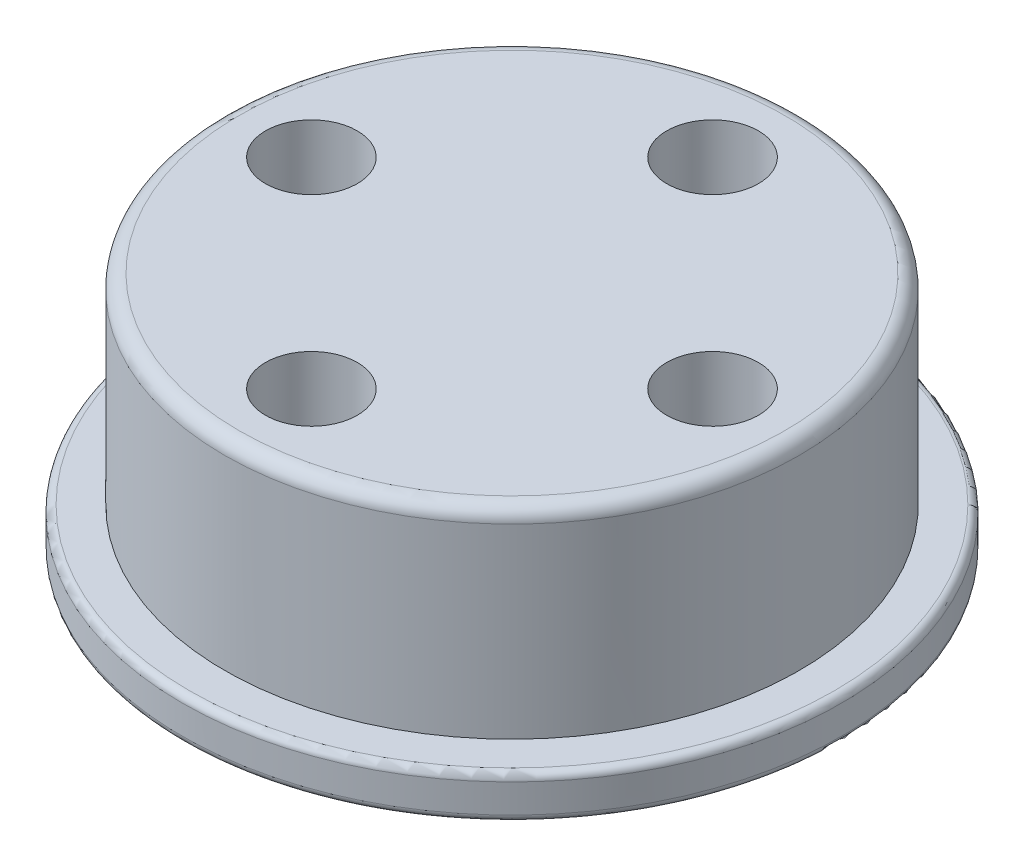
ISO-10303-21;
HEADER;
FILE_DESCRIPTION(('STEP AP214'),'2;1');
FILE_NAME('part.step','',(''),(''),'','','');
FILE_SCHEMA(('AUTOMOTIVE_DESIGN { 1 0 10303 214 1 1 1 1 }'));
ENDSEC;
DATA;
#1=APPLICATION_CONTEXT('core data for automotive mechanical design processes');
#2=APPLICATION_PROTOCOL_DEFINITION('international standard','automotive_design',2000,#1);
#3=PRODUCT_CONTEXT('',#1,'mechanical');
#4=PRODUCT('Part','Part','',(#3));
#5=PRODUCT_RELATED_PRODUCT_CATEGORY('part','',(#4));
#6=PRODUCT_DEFINITION_FORMATION('','',#4);
#7=PRODUCT_DEFINITION_CONTEXT('part definition',#1,'design');
#8=PRODUCT_DEFINITION('design','',#6,#7);
#9=PRODUCT_DEFINITION_SHAPE('','',#8);
#10=(LENGTH_UNIT() NAMED_UNIT(*) SI_UNIT(.MILLI.,.METRE.));
#11=(NAMED_UNIT(*) PLANE_ANGLE_UNIT() SI_UNIT($,.RADIAN.));
#12=(NAMED_UNIT(*) SI_UNIT($,.STERADIAN.) SOLID_ANGLE_UNIT());
#13=UNCERTAINTY_MEASURE_WITH_UNIT(LENGTH_MEASURE(1.E-05),#10,'distance_accuracy_value','');
#14=(GEOMETRIC_REPRESENTATION_CONTEXT(3) GLOBAL_UNCERTAINTY_ASSIGNED_CONTEXT((#13)) GLOBAL_UNIT_ASSIGNED_CONTEXT((#10,
#11,#12)) REPRESENTATION_CONTEXT('',''));
#15=CARTESIAN_POINT('',(0.,0.,0.));
#16=DIRECTION('',(0.,0.,1.));
#17=DIRECTION('',(1.,0.,0.));
#18=AXIS2_PLACEMENT_3D('',#15,#16,#17);
#19=CARTESIAN_POINT('',(11.5,0.,0.));
#20=DIRECTION('',(0.,-1.,0.));
#21=DIRECTION('',(0.,0.,-1.));
#22=AXIS2_PLACEMENT_3D('',#19,#20,#21);
#23=PLANE('',#22);
#24=CARTESIAN_POINT('',(0.,0.,0.));
#25=DIRECTION('',(0.,-1.,0.));
#26=DIRECTION('',(0.,0.,-1.));
#27=AXIS2_PLACEMENT_3D('',#24,#25,#26);
#28=CIRCLE('',#27,11.25);
#29=CARTESIAN_POINT('',(0.,0.,-11.25));
#30=VERTEX_POINT('',#29);
#31=EDGE_CURVE('E58',#30,#30,#28,.T.);
#32=ORIENTED_EDGE('',*,*,#31,.T.);
#33=EDGE_LOOP('',(#32));
#34=FACE_BOUND('',#33,.T.);
#35=CARTESIAN_POINT('',(0.,0.,7.));
#36=DIRECTION('',(0.,-1.,0.));
#37=DIRECTION('',(0.,0.,-1.));
#38=AXIS2_PLACEMENT_3D('',#35,#36,#37);
#39=CIRCLE('',#38,3.25);
#40=CARTESIAN_POINT('',(0.,0.,3.75));
#41=VERTEX_POINT('',#40);
#42=EDGE_CURVE('E77',#41,#41,#39,.T.);
#43=ORIENTED_EDGE('',*,*,#42,.F.);
#44=EDGE_LOOP('',(#43));
#45=FACE_BOUND('',#44,.T.);
#46=CARTESIAN_POINT('',(7.00000000000018,0.,1.83577696838436E-13));
#47=DIRECTION('',(0.,-1.,0.));
#48=DIRECTION('',(0.,0.,-1.));
#49=AXIS2_PLACEMENT_3D('',#46,#47,#48);
#50=CIRCLE('',#49,3.25);
#51=CARTESIAN_POINT('',(7.00000000000018,0.,-3.24999999999982));
#52=VERTEX_POINT('',#51);
#53=EDGE_CURVE('E76',#52,#52,#50,.T.);
#54=ORIENTED_EDGE('',*,*,#53,.F.);
#55=EDGE_LOOP('',(#54));
#56=FACE_BOUND('',#55,.T.);
#57=CARTESIAN_POINT('',(3.67155393676872E-13,0.,-7.));
#58=DIRECTION('',(0.,-1.,0.));
#59=DIRECTION('',(0.,0.,-1.));
#60=AXIS2_PLACEMENT_3D('',#57,#58,#59);
#61=CIRCLE('',#60,3.25);
#62=CARTESIAN_POINT('',(3.67155393676872E-13,0.,-10.25));
#63=VERTEX_POINT('',#62);
#64=EDGE_CURVE('E81',#63,#63,#61,.T.);
#65=ORIENTED_EDGE('',*,*,#64,.F.);
#66=EDGE_LOOP('',(#65));
#67=FACE_BOUND('',#66,.T.);
#68=CARTESIAN_POINT('',(-6.99999999999982,0.,-1.84434949597839E-13));
#69=DIRECTION('',(0.,-1.,0.));
#70=DIRECTION('',(0.,0.,-1.));
#71=AXIS2_PLACEMENT_3D('',#68,#69,#70);
#72=CIRCLE('',#71,3.25);
#73=CARTESIAN_POINT('',(-6.99999999999982,0.,-3.25000000000018));
#74=VERTEX_POINT('',#73);
#75=EDGE_CURVE('E85',#74,#74,#72,.T.);
#76=ORIENTED_EDGE('',*,*,#75,.F.);
#77=EDGE_LOOP('',(#76));
#78=FACE_BOUND('',#77,.T.);
#79=ADVANCED_FACE('F37',(#34,#45,#56,#67,#78),#23,.T.);
#80=CARTESIAN_POINT('',(0.,8.5,0.));
#81=DIRECTION('',(0.,1.,0.));
#82=DIRECTION('',(0.,0.,1.));
#83=AXIS2_PLACEMENT_3D('',#80,#81,#82);
#84=PLANE('',#83);
#85=CARTESIAN_POINT('',(0.,8.5,0.));
#86=DIRECTION('',(0.,1.,0.));
#87=DIRECTION('',(0.,0.,1.));
#88=AXIS2_PLACEMENT_3D('',#85,#86,#87);
#89=CIRCLE('',#88,9.525);
#90=CARTESIAN_POINT('',(0.,8.5,9.525));
#91=VERTEX_POINT('',#90);
#92=EDGE_CURVE('E64',#91,#91,#89,.T.);
#93=ORIENTED_EDGE('',*,*,#92,.T.);
#94=EDGE_LOOP('',(#93));
#95=FACE_BOUND('',#94,.T.);
#96=CARTESIAN_POINT('',(0.,8.5,7.));
#97=DIRECTION('',(0.,-1.,0.));
#98=DIRECTION('',(0.,0.,-1.));
#99=AXIS2_PLACEMENT_3D('',#96,#97,#98);
#100=CIRCLE('',#99,1.6);
#101=CARTESIAN_POINT('',(0.,8.5,5.4));
#102=VERTEX_POINT('',#101);
#103=EDGE_CURVE('E92',#102,#102,#100,.T.);
#104=ORIENTED_EDGE('',*,*,#103,.T.);
#105=EDGE_LOOP('',(#104));
#106=FACE_BOUND('',#105,.T.);
#107=CARTESIAN_POINT('',(7.00000000000018,8.5,1.83577696838436E-13));
#108=DIRECTION('',(0.,-1.,0.));
#109=DIRECTION('',(0.,0.,-1.));
#110=AXIS2_PLACEMENT_3D('',#107,#108,#109);
#111=CIRCLE('',#110,1.6);
#112=CARTESIAN_POINT('',(7.00000000000018,8.5,-1.59999999999982));
#113=VERTEX_POINT('',#112);
#114=EDGE_CURVE('E98',#113,#113,#111,.T.);
#115=ORIENTED_EDGE('',*,*,#114,.T.);
#116=EDGE_LOOP('',(#115));
#117=FACE_BOUND('',#116,.T.);
#118=CARTESIAN_POINT('',(3.67155393676872E-13,8.5,-7.));
#119=DIRECTION('',(0.,-1.,0.));
#120=DIRECTION('',(0.,0.,-1.));
#121=AXIS2_PLACEMENT_3D('',#118,#119,#120);
#122=CIRCLE('',#121,1.6);
#123=CARTESIAN_POINT('',(3.67155393676872E-13,8.5,-8.6));
#124=VERTEX_POINT('',#123);
#125=EDGE_CURVE('E95',#124,#124,#122,.T.);
#126=ORIENTED_EDGE('',*,*,#125,.T.);
#127=EDGE_LOOP('',(#126));
#128=FACE_BOUND('',#127,.T.);
#129=CARTESIAN_POINT('',(-6.99999999999982,8.5,-1.84434949597839E-13));
#130=DIRECTION('',(0.,-1.,0.));
#131=DIRECTION('',(0.,0.,-1.));
#132=AXIS2_PLACEMENT_3D('',#129,#130,#131);
#133=CIRCLE('',#132,1.6);
#134=CARTESIAN_POINT('',(-6.99999999999982,8.5,-1.60000000000018));
#135=VERTEX_POINT('',#134);
#136=EDGE_CURVE('E89',#135,#135,#133,.T.);
#137=ORIENTED_EDGE('',*,*,#136,.T.);
#138=EDGE_LOOP('',(#137));
#139=FACE_BOUND('',#138,.T.);
#140=ADVANCED_FACE('F118',(#95,#106,#117,#128,#139),#84,.T.);
#141=CARTESIAN_POINT('',(0.,0.,0.));
#142=DIRECTION('',(0.,-1.,0.));
#143=DIRECTION('',(0.,0.,-1.));
#144=AXIS2_PLACEMENT_3D('',#141,#142,#143);
#145=CYLINDRICAL_SURFACE('',#144,10.025);
#146=CARTESIAN_POINT('',(0.,8.,0.));
#147=DIRECTION('',(0.,1.,0.));
#148=DIRECTION('',(0.,0.,1.));
#149=AXIS2_PLACEMENT_3D('',#146,#147,#148);
#150=CIRCLE('',#149,10.025);
#151=CARTESIAN_POINT('',(0.,8.,10.025));
#152=VERTEX_POINT('',#151);
#153=EDGE_CURVE('E68',#152,#152,#150,.F.);
#154=ORIENTED_EDGE('',*,*,#153,.T.);
#155=EDGE_LOOP('',(#154));
#156=FACE_BOUND('',#155,.T.);
#157=CARTESIAN_POINT('',(0.,1.5,0.));
#158=DIRECTION('',(0.,-1.,0.));
#159=DIRECTION('',(0.,0.,-1.));
#160=AXIS2_PLACEMENT_3D('',#157,#158,#159);
#161=CIRCLE('',#160,10.025);
#162=CARTESIAN_POINT('',(0.,1.5,-10.025));
#163=VERTEX_POINT('',#162);
#164=EDGE_CURVE('E72',#163,#163,#161,.T.);
#165=ORIENTED_EDGE('',*,*,#164,.F.);
#166=EDGE_LOOP('',(#165));
#167=FACE_BOUND('',#166,.T.);
#168=ADVANCED_FACE('F144',(#156,#167),#145,.T.);
#169=CARTESIAN_POINT('',(10.025,1.5,0.));
#170=DIRECTION('',(0.,1.,0.));
#171=DIRECTION('',(0.,0.,1.));
#172=AXIS2_PLACEMENT_3D('',#169,#170,#171);
#173=PLANE('',#172);
#174=CARTESIAN_POINT('',(0.,1.5,0.));
#175=DIRECTION('',(0.,1.,0.));
#176=DIRECTION('',(0.,0.,1.));
#177=AXIS2_PLACEMENT_3D('',#174,#175,#176);
#178=CIRCLE('',#177,11.25);
#179=CARTESIAN_POINT('',(0.,1.5,11.25));
#180=VERTEX_POINT('',#179);
#181=EDGE_CURVE('E10',#180,#180,#178,.T.);
#182=ORIENTED_EDGE('',*,*,#181,.T.);
#183=EDGE_LOOP('',(#182));
#184=FACE_BOUND('',#183,.T.);
#185=ORIENTED_EDGE('',*,*,#164,.T.);
#186=EDGE_LOOP('',(#185));
#187=FACE_BOUND('',#186,.T.);
#188=ADVANCED_FACE('F150',(#184,#187),#173,.T.);
#189=CARTESIAN_POINT('',(0.,0.,0.));
#190=DIRECTION('',(0.,-1.,0.));
#191=DIRECTION('',(0.,0.,-1.));
#192=AXIS2_PLACEMENT_3D('',#189,#190,#191);
#193=CYLINDRICAL_SURFACE('',#192,11.5);
#194=CARTESIAN_POINT('',(0.,0.25,0.));
#195=DIRECTION('',(0.,-1.,0.));
#196=DIRECTION('',(0.,0.,-1.));
#197=AXIS2_PLACEMENT_3D('',#194,#195,#196);
#198=CIRCLE('',#197,11.5);
#199=CARTESIAN_POINT('',(0.,0.25,-11.5));
#200=VERTEX_POINT('',#199);
#201=EDGE_CURVE('E45',#200,#200,#198,.F.);
#202=ORIENTED_EDGE('',*,*,#201,.T.);
#203=EDGE_LOOP('',(#202));
#204=FACE_BOUND('',#203,.T.);
#205=CARTESIAN_POINT('',(0.,1.25,0.));
#206=DIRECTION('',(0.,1.,0.));
#207=DIRECTION('',(0.,0.,1.));
#208=AXIS2_PLACEMENT_3D('',#205,#206,#207);
#209=CIRCLE('',#208,11.5);
#210=CARTESIAN_POINT('',(0.,1.25,11.5));
#211=VERTEX_POINT('',#210);
#212=EDGE_CURVE('E52',#211,#211,#209,.F.);
#213=ORIENTED_EDGE('',*,*,#212,.T.);
#214=EDGE_LOOP('',(#213));
#215=FACE_BOUND('',#214,.T.);
#216=ADVANCED_FACE('F139',(#204,#215),#193,.T.);
#217=CARTESIAN_POINT('',(-6.99999999999982,8.5,-1.84434949597839E-13));
#218=DIRECTION('',(0.,-1.,0.));
#219=DIRECTION('',(0.,0.,-1.));
#220=AXIS2_PLACEMENT_3D('',#217,#218,#219);
#221=CYLINDRICAL_SURFACE('',#220,1.6);
#222=CARTESIAN_POINT('',(-6.99999999999982,1.65,-1.84434949597839E-13));
#223=DIRECTION('',(0.,-1.,0.));
#224=DIRECTION('',(0.,0.,-1.));
#225=AXIS2_PLACEMENT_3D('',#222,#223,#224);
#226=CIRCLE('',#225,1.6);
#227=CARTESIAN_POINT('',(-6.99999999999982,1.65,-1.60000000000018));
#228=VERTEX_POINT('',#227);
#229=EDGE_CURVE('E86',#228,#228,#226,.T.);
#230=ORIENTED_EDGE('',*,*,#229,.T.);
#231=EDGE_LOOP('',(#230));
#232=FACE_BOUND('',#231,.T.);
#233=ORIENTED_EDGE('',*,*,#136,.F.);
#234=EDGE_LOOP('',(#233));
#235=FACE_BOUND('',#234,.T.);
#236=ADVANCED_FACE('F135',(#232,#235),#221,.F.);
#237=CARTESIAN_POINT('',(3.67155393676872E-13,8.5,-7.));
#238=DIRECTION('',(0.,-1.,0.));
#239=DIRECTION('',(0.,0.,-1.));
#240=AXIS2_PLACEMENT_3D('',#237,#238,#239);
#241=CYLINDRICAL_SURFACE('',#240,1.6);
#242=CARTESIAN_POINT('',(3.67155393676872E-13,1.65,-7.));
#243=DIRECTION('',(0.,-1.,0.));
#244=DIRECTION('',(0.,0.,-1.));
#245=AXIS2_PLACEMENT_3D('',#242,#243,#244);
#246=CIRCLE('',#245,1.6);
#247=CARTESIAN_POINT('',(3.67155393676872E-13,1.65,-8.6));
#248=VERTEX_POINT('',#247);
#249=EDGE_CURVE('E82',#248,#248,#246,.T.);
#250=ORIENTED_EDGE('',*,*,#249,.T.);
#251=EDGE_LOOP('',(#250));
#252=FACE_BOUND('',#251,.T.);
#253=ORIENTED_EDGE('',*,*,#125,.F.);
#254=EDGE_LOOP('',(#253));
#255=FACE_BOUND('',#254,.T.);
#256=ADVANCED_FACE('F138',(#252,#255),#241,.F.);
#257=CARTESIAN_POINT('',(7.00000000000018,8.5,1.83577696838436E-13));
#258=DIRECTION('',(0.,-1.,0.));
#259=DIRECTION('',(0.,0.,-1.));
#260=AXIS2_PLACEMENT_3D('',#257,#258,#259);
#261=CYLINDRICAL_SURFACE('',#260,1.6);
#262=CARTESIAN_POINT('',(7.00000000000018,1.65,1.83577696838436E-13));
#263=DIRECTION('',(0.,-1.,0.));
#264=DIRECTION('',(0.,0.,-1.));
#265=AXIS2_PLACEMENT_3D('',#262,#263,#264);
#266=CIRCLE('',#265,1.6);
#267=CARTESIAN_POINT('',(7.00000000000018,1.65,-1.59999999999982));
#268=VERTEX_POINT('',#267);
#269=EDGE_CURVE('E78',#268,#268,#266,.T.);
#270=ORIENTED_EDGE('',*,*,#269,.T.);
#271=EDGE_LOOP('',(#270));
#272=FACE_BOUND('',#271,.T.);
#273=ORIENTED_EDGE('',*,*,#114,.F.);
#274=EDGE_LOOP('',(#273));
#275=FACE_BOUND('',#274,.T.);
#276=ADVANCED_FACE('F181',(#272,#275),#261,.F.);
#277=CARTESIAN_POINT('',(0.,8.5,7.));
#278=DIRECTION('',(0.,-1.,0.));
#279=DIRECTION('',(0.,0.,-1.));
#280=AXIS2_PLACEMENT_3D('',#277,#278,#279);
#281=CYLINDRICAL_SURFACE('',#280,1.6);
#282=CARTESIAN_POINT('',(0.,1.65,7.));
#283=DIRECTION('',(0.,-1.,0.));
#284=DIRECTION('',(0.,0.,-1.));
#285=AXIS2_PLACEMENT_3D('',#282,#283,#284);
#286=CIRCLE('',#285,1.6);
#287=CARTESIAN_POINT('',(0.,1.65,5.4));
#288=VERTEX_POINT('',#287);
#289=EDGE_CURVE('E73',#288,#288,#286,.T.);
#290=ORIENTED_EDGE('',*,*,#289,.T.);
#291=EDGE_LOOP('',(#290));
#292=FACE_BOUND('',#291,.T.);
#293=ORIENTED_EDGE('',*,*,#103,.F.);
#294=EDGE_LOOP('',(#293));
#295=FACE_BOUND('',#294,.T.);
#296=ADVANCED_FACE('F131',(#292,#295),#281,.F.);
#297=CARTESIAN_POINT('',(-6.99999999999982,0.,-1.84434949597839E-13));
#298=DIRECTION('',(0.,-1.,0.));
#299=DIRECTION('',(0.,0.,-1.));
#300=AXIS2_PLACEMENT_3D('',#297,#298,#299);
#301=CONICAL_SURFACE('',#300,3.25,0.785398163397448);
#302=ORIENTED_EDGE('',*,*,#75,.T.);
#303=EDGE_LOOP('',(#302));
#304=FACE_BOUND('',#303,.T.);
#305=ORIENTED_EDGE('',*,*,#229,.F.);
#306=EDGE_LOOP('',(#305));
#307=FACE_BOUND('',#306,.T.);
#308=ADVANCED_FACE('F127',(#304,#307),#301,.F.);
#309=CARTESIAN_POINT('',(3.67155393676872E-13,0.,-7.));
#310=DIRECTION('',(0.,-1.,0.));
#311=DIRECTION('',(0.,0.,-1.));
#312=AXIS2_PLACEMENT_3D('',#309,#310,#311);
#313=CONICAL_SURFACE('',#312,3.25,0.785398163397448);
#314=ORIENTED_EDGE('',*,*,#64,.T.);
#315=EDGE_LOOP('',(#314));
#316=FACE_BOUND('',#315,.T.);
#317=ORIENTED_EDGE('',*,*,#249,.F.);
#318=EDGE_LOOP('',(#317));
#319=FACE_BOUND('',#318,.T.);
#320=ADVANCED_FACE('F130',(#316,#319),#313,.F.);
#321=CARTESIAN_POINT('',(7.00000000000018,0.,1.83577696838436E-13));
#322=DIRECTION('',(0.,-1.,0.));
#323=DIRECTION('',(0.,0.,-1.));
#324=AXIS2_PLACEMENT_3D('',#321,#322,#323);
#325=CONICAL_SURFACE('',#324,3.25,0.785398163397448);
#326=ORIENTED_EDGE('',*,*,#53,.T.);
#327=EDGE_LOOP('',(#326));
#328=FACE_BOUND('',#327,.T.);
#329=ORIENTED_EDGE('',*,*,#269,.F.);
#330=EDGE_LOOP('',(#329));
#331=FACE_BOUND('',#330,.T.);
#332=ADVANCED_FACE('F191',(#328,#331),#325,.F.);
#333=CARTESIAN_POINT('',(0.,0.,7.));
#334=DIRECTION('',(0.,-1.,0.));
#335=DIRECTION('',(0.,0.,-1.));
#336=AXIS2_PLACEMENT_3D('',#333,#334,#335);
#337=CONICAL_SURFACE('',#336,3.25,0.785398163397448);
#338=ORIENTED_EDGE('',*,*,#42,.T.);
#339=EDGE_LOOP('',(#338));
#340=FACE_BOUND('',#339,.T.);
#341=ORIENTED_EDGE('',*,*,#289,.F.);
#342=EDGE_LOOP('',(#341));
#343=FACE_BOUND('',#342,.T.);
#344=ADVANCED_FACE('F113',(#340,#343),#337,.F.);
#345=CARTESIAN_POINT('',(0.,8.,0.));
#346=DIRECTION('',(0.,1.,0.));
#347=DIRECTION('',(0.,0.,1.));
#348=AXIS2_PLACEMENT_3D('',#345,#346,#347);
#349=TOROIDAL_SURFACE('',#348,9.525,0.5);
#350=ORIENTED_EDGE('',*,*,#92,.F.);
#351=EDGE_LOOP('',(#350));
#352=FACE_BOUND('',#351,.T.);
#353=ORIENTED_EDGE('',*,*,#153,.F.);
#354=EDGE_LOOP('',(#353));
#355=FACE_BOUND('',#354,.T.);
#356=ADVANCED_FACE('F156',(#352,#355),#349,.T.);
#357=CARTESIAN_POINT('',(0.,0.25,0.));
#358=DIRECTION('',(0.,-1.,0.));
#359=DIRECTION('',(0.,0.,-1.));
#360=AXIS2_PLACEMENT_3D('',#357,#358,#359);
#361=TOROIDAL_SURFACE('',#360,11.25,0.25);
#362=ORIENTED_EDGE('',*,*,#201,.F.);
#363=EDGE_LOOP('',(#362));
#364=FACE_BOUND('',#363,.T.);
#365=ORIENTED_EDGE('',*,*,#31,.F.);
#366=EDGE_LOOP('',(#365));
#367=FACE_BOUND('',#366,.T.);
#368=ADVANCED_FACE('F158',(#364,#367),#361,.T.);
#369=CARTESIAN_POINT('',(0.,1.25,0.));
#370=DIRECTION('',(0.,1.,0.));
#371=DIRECTION('',(0.,0.,1.));
#372=AXIS2_PLACEMENT_3D('',#369,#370,#371);
#373=TOROIDAL_SURFACE('',#372,11.25,0.25);
#374=ORIENTED_EDGE('',*,*,#181,.F.);
#375=EDGE_LOOP('',(#374));
#376=FACE_BOUND('',#375,.T.);
#377=ORIENTED_EDGE('',*,*,#212,.F.);
#378=EDGE_LOOP('',(#377));
#379=FACE_BOUND('',#378,.T.);
#380=ADVANCED_FACE('F39',(#376,#379),#373,.T.);
#381=CLOSED_SHELL('',(#79,#140,#168,#188,#216,#236,#256,#276,#296,#308,#320,#332,#344,#356,#368,#380));
#382=MANIFOLD_SOLID_BREP('B2',#381);
#383=ADVANCED_BREP_SHAPE_REPRESENTATION('',(#18,#382),#14);
#384=SHAPE_DEFINITION_REPRESENTATION(#9,#383);
ENDSEC;
END-ISO-10303-21;
